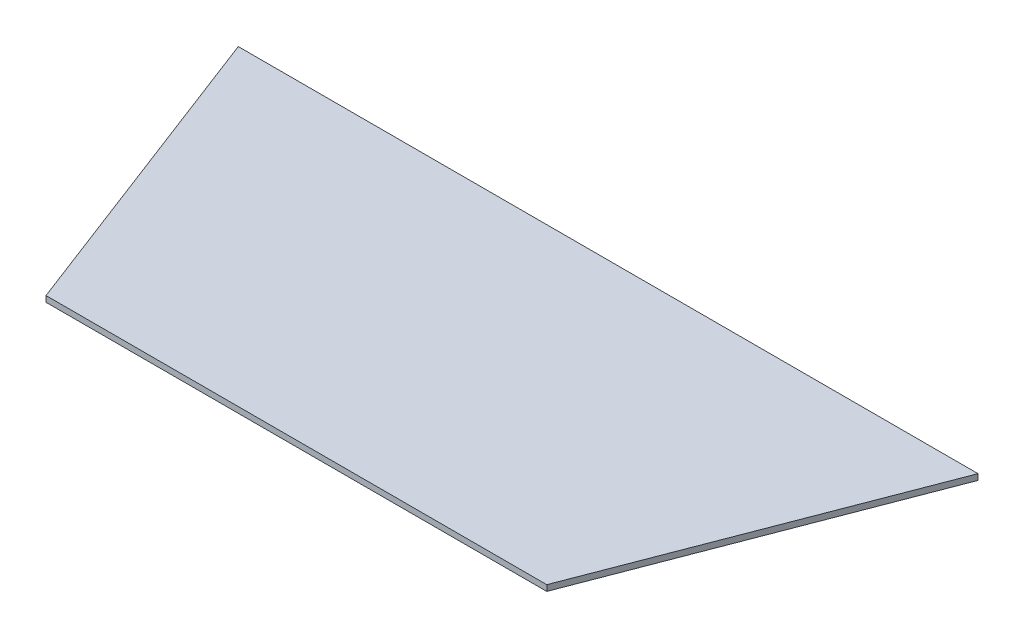
ISO-10303-21;
HEADER;
FILE_DESCRIPTION(('STEP AP214'),'2;1');
FILE_NAME('part.step','',(''),(''),'','','');
FILE_SCHEMA(('AUTOMOTIVE_DESIGN { 1 0 10303 214 1 1 1 1 }'));
ENDSEC;
DATA;
#1=APPLICATION_CONTEXT('core data for automotive mechanical design processes');
#2=APPLICATION_PROTOCOL_DEFINITION('international standard','automotive_design',2000,#1);
#3=PRODUCT_CONTEXT('',#1,'mechanical');
#4=PRODUCT('Part','Part','',(#3));
#5=PRODUCT_RELATED_PRODUCT_CATEGORY('part','',(#4));
#6=PRODUCT_DEFINITION_FORMATION('','',#4);
#7=PRODUCT_DEFINITION_CONTEXT('part definition',#1,'design');
#8=PRODUCT_DEFINITION('design','',#6,#7);
#9=PRODUCT_DEFINITION_SHAPE('','',#8);
#10=(LENGTH_UNIT() NAMED_UNIT(*) SI_UNIT(.MILLI.,.METRE.));
#11=(NAMED_UNIT(*) PLANE_ANGLE_UNIT() SI_UNIT($,.RADIAN.));
#12=(NAMED_UNIT(*) SI_UNIT($,.STERADIAN.) SOLID_ANGLE_UNIT());
#13=UNCERTAINTY_MEASURE_WITH_UNIT(LENGTH_MEASURE(1.E-05),#10,'distance_accuracy_value','');
#14=(GEOMETRIC_REPRESENTATION_CONTEXT(3) GLOBAL_UNCERTAINTY_ASSIGNED_CONTEXT((#13)) GLOBAL_UNIT_ASSIGNED_CONTEXT((#10,
#11,#12)) REPRESENTATION_CONTEXT('',''));
#15=CARTESIAN_POINT('',(0.,0.,0.));
#16=DIRECTION('',(0.,0.,1.));
#17=DIRECTION('',(1.,0.,0.));
#18=AXIS2_PLACEMENT_3D('',#15,#16,#17);
#19=CARTESIAN_POINT('',(-125.760920803888,2.,-106.));
#20=DIRECTION('',(0.,0.,1.));
#21=DIRECTION('',(1.,0.,0.));
#22=AXIS2_PLACEMENT_3D('',#19,#20,#21);
#23=PLANE('',#22);
#24=DIRECTION('',(-1.,0.,0.));
#25=VECTOR('',#24,1.);
#26=CARTESIAN_POINT('',(-125.760920803888,0.,-106.));
#27=LINE('',#26,#25);
#28=CARTESIAN_POINT('',(125.760920803888,0.,-106.));
#29=VERTEX_POINT('',#28);
#30=CARTESIAN_POINT('',(-125.760920803888,0.,-106.));
#31=VERTEX_POINT('',#30);
#32=EDGE_CURVE('E103',#29,#31,#27,.T.);
#33=ORIENTED_EDGE('',*,*,#32,.T.);
#34=DIRECTION('',(0.,-1.,0.));
#35=VECTOR('',#34,1.);
#36=CARTESIAN_POINT('',(-125.760920803888,2.,-106.));
#37=LINE('',#36,#35);
#38=CARTESIAN_POINT('',(-125.760920803888,2.,-106.));
#39=VERTEX_POINT('',#38);
#40=EDGE_CURVE('E11',#39,#31,#37,.T.);
#41=ORIENTED_EDGE('',*,*,#40,.F.);
#42=DIRECTION('',(-1.,0.,0.));
#43=VECTOR('',#42,1.);
#44=CARTESIAN_POINT('',(-125.760920803888,2.,-106.));
#45=LINE('',#44,#43);
#46=CARTESIAN_POINT('',(125.760920803888,2.,-106.));
#47=VERTEX_POINT('',#46);
#48=EDGE_CURVE('E91',#47,#39,#45,.T.);
#49=ORIENTED_EDGE('',*,*,#48,.F.);
#50=DIRECTION('',(0.,-1.,0.));
#51=VECTOR('',#50,1.);
#52=CARTESIAN_POINT('',(125.760920803888,2.,-106.));
#53=LINE('',#52,#51);
#54=EDGE_CURVE('E99',#47,#29,#53,.T.);
#55=ORIENTED_EDGE('',*,*,#54,.T.);
#56=EDGE_LOOP('',(#33,#41,#49,#55));
#57=FACE_BOUND('',#56,.T.);
#58=ADVANCED_FACE('F40',(#57),#23,.F.);
#59=CARTESIAN_POINT('',(-85.135,2.,0.));
#60=DIRECTION('',(0.93376793953504,0.,-0.357879078875094));
#61=DIRECTION('',(-0.357879078875094,0.,-0.93376793953504));
#62=AXIS2_PLACEMENT_3D('',#59,#60,#61);
#63=PLANE('',#62);
#64=DIRECTION('',(0.357879078875094,0.,0.93376793953504));
#65=VECTOR('',#64,1.);
#66=CARTESIAN_POINT('',(-85.135,0.,0.));
#67=LINE('',#66,#65);
#68=CARTESIAN_POINT('',(-85.135,0.,0.));
#69=VERTEX_POINT('',#68);
#70=EDGE_CURVE('E95',#31,#69,#67,.T.);
#71=ORIENTED_EDGE('',*,*,#70,.T.);
#72=DIRECTION('',(0.,-1.,0.));
#73=VECTOR('',#72,1.);
#74=CARTESIAN_POINT('',(-85.135,2.,0.));
#75=LINE('',#74,#73);
#76=CARTESIAN_POINT('',(-85.135,2.,0.));
#77=VERTEX_POINT('',#76);
#78=EDGE_CURVE('E48',#77,#69,#75,.T.);
#79=ORIENTED_EDGE('',*,*,#78,.F.);
#80=DIRECTION('',(0.357879078875094,0.,0.93376793953504));
#81=VECTOR('',#80,1.);
#82=CARTESIAN_POINT('',(-85.135,2.,0.));
#83=LINE('',#82,#81);
#84=EDGE_CURVE('E86',#39,#77,#83,.T.);
#85=ORIENTED_EDGE('',*,*,#84,.F.);
#86=ORIENTED_EDGE('',*,*,#40,.T.);
#87=EDGE_LOOP('',(#71,#79,#85,#86));
#88=FACE_BOUND('',#87,.T.);
#89=ADVANCED_FACE('F94',(#88),#63,.F.);
#90=CARTESIAN_POINT('',(85.135,2.,0.));
#91=DIRECTION('',(0.,0.,-1.));
#92=DIRECTION('',(-1.,0.,0.));
#93=AXIS2_PLACEMENT_3D('',#90,#91,#92);
#94=PLANE('',#93);
#95=DIRECTION('',(1.,0.,0.));
#96=VECTOR('',#95,1.);
#97=CARTESIAN_POINT('',(85.135,0.,0.));
#98=LINE('',#97,#96);
#99=CARTESIAN_POINT('',(85.135,0.,0.));
#100=VERTEX_POINT('',#99);
#101=EDGE_CURVE('E73',#69,#100,#98,.T.);
#102=ORIENTED_EDGE('',*,*,#101,.T.);
#103=DIRECTION('',(0.,-1.,0.));
#104=VECTOR('',#103,1.);
#105=CARTESIAN_POINT('',(85.135,2.,0.));
#106=LINE('',#105,#104);
#107=CARTESIAN_POINT('',(85.135,2.,0.));
#108=VERTEX_POINT('',#107);
#109=EDGE_CURVE('E96',#108,#100,#106,.T.);
#110=ORIENTED_EDGE('',*,*,#109,.F.);
#111=DIRECTION('',(1.,0.,0.));
#112=VECTOR('',#111,1.);
#113=CARTESIAN_POINT('',(85.135,2.,0.));
#114=LINE('',#113,#112);
#115=EDGE_CURVE('E89',#77,#108,#114,.T.);
#116=ORIENTED_EDGE('',*,*,#115,.F.);
#117=ORIENTED_EDGE('',*,*,#78,.T.);
#118=EDGE_LOOP('',(#102,#110,#116,#117));
#119=FACE_BOUND('',#118,.T.);
#120=ADVANCED_FACE('F97',(#119),#94,.F.);
#121=CARTESIAN_POINT('',(125.760920803888,2.,-106.));
#122=DIRECTION('',(-0.93376793953504,0.,-0.357879078875094));
#123=DIRECTION('',(-0.357879078875094,0.,0.93376793953504));
#124=AXIS2_PLACEMENT_3D('',#121,#122,#123);
#125=PLANE('',#124);
#126=DIRECTION('',(0.357879078875094,0.,-0.93376793953504));
#127=VECTOR('',#126,1.);
#128=CARTESIAN_POINT('',(125.760920803888,0.,-106.));
#129=LINE('',#128,#127);
#130=EDGE_CURVE('E79',#100,#29,#129,.T.);
#131=ORIENTED_EDGE('',*,*,#130,.T.);
#132=ORIENTED_EDGE('',*,*,#54,.F.);
#133=DIRECTION('',(0.357879078875094,0.,-0.93376793953504));
#134=VECTOR('',#133,1.);
#135=CARTESIAN_POINT('',(125.760920803888,2.,-106.));
#136=LINE('',#135,#134);
#137=EDGE_CURVE('E56',#108,#47,#136,.T.);
#138=ORIENTED_EDGE('',*,*,#137,.F.);
#139=ORIENTED_EDGE('',*,*,#109,.T.);
#140=EDGE_LOOP('',(#131,#132,#138,#139));
#141=FACE_BOUND('',#140,.T.);
#142=ADVANCED_FACE('F110',(#141),#125,.F.);
#143=CARTESIAN_POINT('',(0.,2.,0.));
#144=DIRECTION('',(0.,-1.,0.));
#145=DIRECTION('',(0.,0.,-1.));
#146=AXIS2_PLACEMENT_3D('',#143,#144,#145);
#147=PLANE('',#146);
#148=ORIENTED_EDGE('',*,*,#48,.T.);
#149=ORIENTED_EDGE('',*,*,#84,.T.);
#150=ORIENTED_EDGE('',*,*,#115,.T.);
#151=ORIENTED_EDGE('',*,*,#137,.T.);
#152=EDGE_LOOP('',(#148,#149,#150,#151));
#153=FACE_BOUND('',#152,.T.);
#154=ADVANCED_FACE('F87',(#153),#147,.F.);
#155=CARTESIAN_POINT('',(0.,0.,0.));
#156=DIRECTION('',(0.,-1.,0.));
#157=DIRECTION('',(0.,0.,-1.));
#158=AXIS2_PLACEMENT_3D('',#155,#156,#157);
#159=PLANE('',#158);
#160=ORIENTED_EDGE('',*,*,#32,.F.);
#161=ORIENTED_EDGE('',*,*,#130,.F.);
#162=ORIENTED_EDGE('',*,*,#101,.F.);
#163=ORIENTED_EDGE('',*,*,#70,.F.);
#164=EDGE_LOOP('',(#160,#161,#162,#163));
#165=FACE_BOUND('',#164,.T.);
#166=ADVANCED_FACE('F113',(#165),#159,.T.);
#167=CLOSED_SHELL('',(#58,#89,#120,#142,#154,#166));
#168=MANIFOLD_SOLID_BREP('B2',#167);
#169=ADVANCED_BREP_SHAPE_REPRESENTATION('',(#18,#168),#14);
#170=SHAPE_DEFINITION_REPRESENTATION(#9,#169);
ENDSEC;
END-ISO-10303-21;
